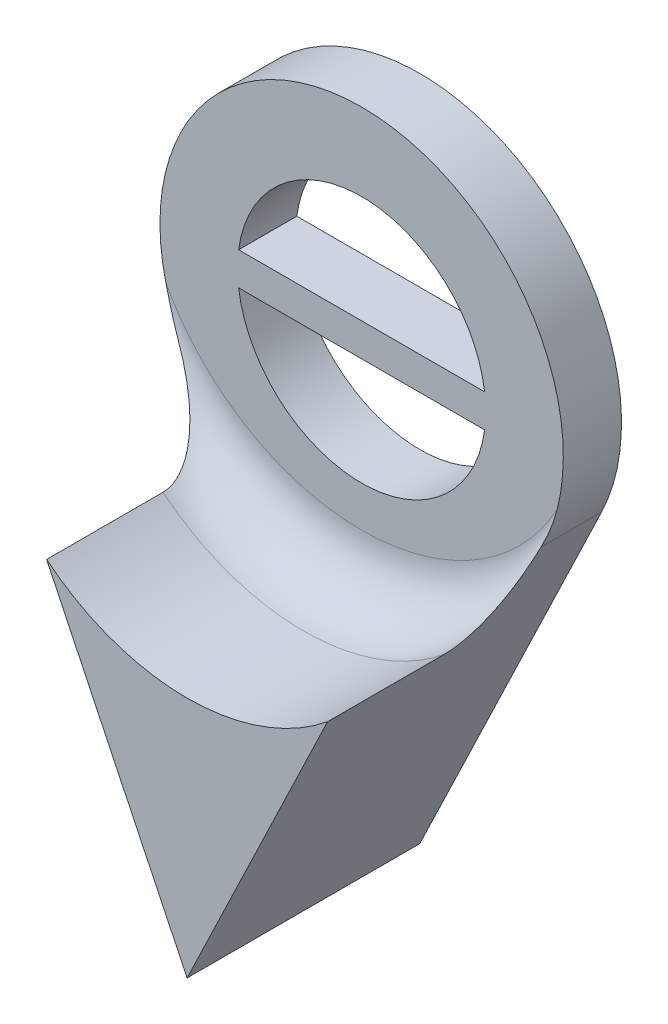
ISO-10303-21;
HEADER;
FILE_DESCRIPTION(('STEP AP214'),'2;1');
FILE_NAME('part.step','',(''),(''),'','','');
FILE_SCHEMA(('AUTOMOTIVE_DESIGN { 1 0 10303 214 1 1 1 1 }'));
ENDSEC;
DATA;
#1=APPLICATION_CONTEXT('core data for automotive mechanical design processes');
#2=APPLICATION_PROTOCOL_DEFINITION('international standard','automotive_design',2000,#1);
#3=PRODUCT_CONTEXT('',#1,'mechanical');
#4=PRODUCT('Part','Part','',(#3));
#5=PRODUCT_RELATED_PRODUCT_CATEGORY('part','',(#4));
#6=PRODUCT_DEFINITION_FORMATION('','',#4);
#7=PRODUCT_DEFINITION_CONTEXT('part definition',#1,'design');
#8=PRODUCT_DEFINITION('design','',#6,#7);
#9=PRODUCT_DEFINITION_SHAPE('','',#8);
#10=(LENGTH_UNIT() NAMED_UNIT(*) SI_UNIT(.MILLI.,.METRE.));
#11=(NAMED_UNIT(*) PLANE_ANGLE_UNIT() SI_UNIT($,.RADIAN.));
#12=(NAMED_UNIT(*) SI_UNIT($,.STERADIAN.) SOLID_ANGLE_UNIT());
#13=UNCERTAINTY_MEASURE_WITH_UNIT(LENGTH_MEASURE(1.E-05),#10,'distance_accuracy_value','');
#14=(GEOMETRIC_REPRESENTATION_CONTEXT(3) GLOBAL_UNCERTAINTY_ASSIGNED_CONTEXT((#13)) GLOBAL_UNIT_ASSIGNED_CONTEXT((#10,
#11,#12)) REPRESENTATION_CONTEXT('',''));
#15=CARTESIAN_POINT('',(0.,0.,0.));
#16=DIRECTION('',(0.,0.,1.));
#17=DIRECTION('',(1.,0.,0.));
#18=AXIS2_PLACEMENT_3D('',#15,#16,#17);
#19=CARTESIAN_POINT('',(5.04566046164159,-2.75750077168198,3.));
#20=CARTESIAN_POINT('',(4.95269364338297,-2.92761096854914,3.));
#21=CARTESIAN_POINT('',(4.85956311955654,-3.0781200618005,3.));
#22=CARTESIAN_POINT('',(4.6734657595974,-3.35393718213141,3.));
#23=CARTESIAN_POINT('',(4.58041709491514,-3.47914142045779,3.));
#24=CARTESIAN_POINT('',(4.30127106270729,-3.82755148794375,3.));
#25=CARTESIAN_POINT('',(4.11517372421482,-4.02402930681562,3.));
#26=CARTESIAN_POINT('',(3.83602769796778,-4.28528098974487,3.));
#27=CARTESIAN_POINT('',(3.74297902629931,-4.36659008857484,3.));
#28=CARTESIAN_POINT('',(3.55688167633855,-4.51946830207754,3.));
#29=CARTESIAN_POINT('',(3.46230001871877,-4.59231286042415,3.));
#30=CARTESIAN_POINT('',(3.17080826048503,-4.80269822972338,3.));
#31=CARTESIAN_POINT('',(2.96771788641945,-4.93077932470745,3.));
#32=CARTESIAN_POINT('',(2.33681773707668,-5.27555870719199,3.));
#33=CARTESIAN_POINT('',(1.88736166855441,-5.45253123116465,3.));
#34=CARTESIAN_POINT('',(0.958574183965192,-5.68975978654546,3.));
#35=CARTESIAN_POINT('',(0.479303843144452,-5.74999998074823,3.));
#36=CARTESIAN_POINT('',(-0.479303381234048,-5.75000001925176,3.));
#37=CARTESIAN_POINT('',(-0.95857372690638,-5.68975986354679,3.));
#38=CARTESIAN_POINT('',(-1.88736123053004,-5.45253138278317,3.));
#39=CARTESIAN_POINT('',(-2.33681731325028,-5.27555889492913,3.));
#40=CARTESIAN_POINT('',(-2.96771749032692,-4.9307795631067,3.));
#41=CARTESIAN_POINT('',(-3.17080787467614,-4.80269848443911,3.));
#42=CARTESIAN_POINT('',(-3.46229964979529,-4.59231313856785,3.));
#43=CARTESIAN_POINT('',(-3.55688131765014,-4.51946858415728,3.));
#44=CARTESIAN_POINT('',(-3.7429786676111,-4.36659039581701,3.));
#45=CARTESIAN_POINT('',(-3.83602733927949,-4.28528131052649,3.));
#46=CARTESIAN_POINT('',(-4.11517336552649,-4.02402967233726,3.));
#47=CARTESIAN_POINT('',(-4.30127070401902,-3.82755188814342,3.));
#48=CARTESIAN_POINT('',(-4.58041673622682,-3.47914189189143,3.));
#49=CARTESIAN_POINT('',(-4.67346540090908,-3.35393768057317,3.));
#50=CARTESIAN_POINT('',(-4.85956276086826,-3.07812062659105,3.));
#51=CARTESIAN_POINT('',(-4.95269328458468,-2.92761157249466,3.));
#52=CARTESIAN_POINT('',(-5.04566010295329,-2.75750142800785,3.));
#53=CARTESIAN_POINT('',(5.04566046164159,-2.75750077168198,1.5));
#54=CARTESIAN_POINT('',(4.95269361850157,-2.92761095554031,1.5));
#55=CARTESIAN_POINT('',(4.85956311359835,-3.07812005778044,1.5));
#56=CARTESIAN_POINT('',(4.67346576555559,-3.35393718615148,1.5));
#57=CARTESIAN_POINT('',(4.58041709153412,-3.47914141774891,1.5));
#58=CARTESIAN_POINT('',(4.30127106946934,-3.8275514933615,1.5));
#59=CARTESIAN_POINT('',(4.11517372142645,-4.02402930383626,1.5));
#60=CARTESIAN_POINT('',(3.83602769936197,-4.28528099123455,1.5));
#61=CARTESIAN_POINT('',(3.74297902534023,-4.36659008740737,1.5));
#62=CARTESIAN_POINT('',(3.55688167729762,-4.51946830324501,1.5));
#63=CARTESIAN_POINT('',(3.46230001871807,-4.59231286042319,1.5));
#64=CARTESIAN_POINT('',(3.17080826048642,-4.80269822972531,1.5));
#65=CARTESIAN_POINT('',(2.96771788642072,-4.93077932470978,1.5));
#66=CARTESIAN_POINT('',(2.33681773707413,-5.27555870718733,1.5));
#67=CARTESIAN_POINT('',(1.88736166855385,-5.45253123116244,1.5));
#68=CARTESIAN_POINT('',(0.958574183965758,-5.68975978654768,1.5));
#69=CARTESIAN_POINT('',(0.479303843144452,-5.74999998074818,1.5));
#70=CARTESIAN_POINT('',(-0.479303381234048,-5.75000001925181,1.5));
#71=CARTESIAN_POINT('',(-0.958573726906959,-5.68975986354906,1.5));
#72=CARTESIAN_POINT('',(-1.88736123052946,-5.45253138278091,1.5));
#73=CARTESIAN_POINT('',(-2.33681731324781,-5.27555889492461,1.5));
#74=CARTESIAN_POINT('',(-2.96771749032815,-4.93077956310896,1.5));
#75=CARTESIAN_POINT('',(-3.17080787467755,-4.80269848444107,1.5));
#76=CARTESIAN_POINT('',(-3.46229964979458,-4.59231313856688,1.5));
#77=CARTESIAN_POINT('',(-3.55688131860921,-4.51946858532474,1.5));
#78=CARTESIAN_POINT('',(-3.74297866665204,-4.36659039464955,1.5));
#79=CARTESIAN_POINT('',(-3.83602734067369,-4.28528131201618,1.5));
#80=CARTESIAN_POINT('',(-4.11517336273809,-4.02402966935787,1.5));
#81=CARTESIAN_POINT('',(-4.30127071078108,-3.82755189356118,1.5));
#82=CARTESIAN_POINT('',(-4.58041673284579,-3.47914188918255,1.5));
#83=CARTESIAN_POINT('',(-4.67346540686725,-3.35393768459323,1.5));
#84=CARTESIAN_POINT('',(-4.85956275491008,-3.07812062257099,1.5));
#85=CARTESIAN_POINT('',(-4.9526932597034,-2.92761155948589,1.5));
#86=CARTESIAN_POINT('',(-5.04566010295329,-2.75750142800785,1.5));
#87=CARTESIAN_POINT('',(5.04566046164159,-1.25750077168198,1.5));
#88=CARTESIAN_POINT('',(4.95269361850167,-1.42761095554045,1.5));
#89=CARTESIAN_POINT('',(4.8595631135986,-1.57812005778052,1.5));
#90=CARTESIAN_POINT('',(4.67346576555552,-1.85393718615151,1.5));
#91=CARTESIAN_POINT('',(4.58041709153407,-1.97914141774896,1.5));
#92=CARTESIAN_POINT('',(4.30127106946945,-2.3275514933614,1.5));
#93=CARTESIAN_POINT('',(4.11517372142644,-2.52402930383605,1.5));
#94=CARTESIAN_POINT('',(3.83602769936197,-2.78528099123465,1.5));
#95=CARTESIAN_POINT('',(3.74297902534044,-2.86659008740727,1.5));
#96=CARTESIAN_POINT('',(3.55688167729741,-3.01946830324511,1.5));
#97=CARTESIAN_POINT('',(3.46230001871799,-3.09231286042321,1.5));
#98=CARTESIAN_POINT('',(3.17080826048657,-3.30269822972526,1.5));
#99=CARTESIAN_POINT('',(2.96771788642082,-3.43077932470978,1.5));
#100=CARTESIAN_POINT('',(2.33681773707392,-3.77555870718733,1.5));
#101=CARTESIAN_POINT('',(1.887361668554,-3.95253123116244,1.5));
#102=CARTESIAN_POINT('',(0.958574183965601,-4.18975978654768,1.5));
#103=CARTESIAN_POINT('',(0.479303843144317,-4.24999998074839,1.5));
#104=CARTESIAN_POINT('',(-0.479303381233915,-4.2500000192516,1.5));
#105=CARTESIAN_POINT('',(-0.958573726906908,-4.18975986354906,1.5));
#106=CARTESIAN_POINT('',(-1.88736123052951,-3.95253138278091,1.5));
#107=CARTESIAN_POINT('',(-2.3368173132476,-3.77555889492471,1.5));
#108=CARTESIAN_POINT('',(-2.96771749032826,-3.43077956310891,1.5));
#109=CARTESIAN_POINT('',(-3.1708078746775,-3.30269848444106,1.5));
#110=CARTESIAN_POINT('',(-3.46229964979461,-3.09231313856688,1.5));
#111=CARTESIAN_POINT('',(-3.55688131860913,-3.01946858532477,1.5));
#112=CARTESIAN_POINT('',(-3.74297866665212,-2.86659039464952,1.5));
#113=CARTESIAN_POINT('',(-3.83602734067364,-2.78528131201623,1.5));
#114=CARTESIAN_POINT('',(-4.1151733627382,-2.52402966935777,1.5));
#115=CARTESIAN_POINT('',(-4.30127071078119,-2.32755189356102,1.5));
#116=CARTESIAN_POINT('',(-4.58041673284574,-1.97914188918263,1.5));
#117=CARTESIAN_POINT('',(-4.67346540686724,-1.85393768459326,1.5));
#118=CARTESIAN_POINT('',(-4.85956275491028,-1.57812062257108,1.5));
#119=CARTESIAN_POINT('',(-4.95269325970326,-1.42761155948588,1.5));
#120=CARTESIAN_POINT('',(-5.0456601029533,-1.25750142800785,1.5));
#121=(BOUNDED_SURFACE() B_SPLINE_SURFACE(2,3,((#19,#20,#21,#22,#23,#24,#25,#26,#27,#28,#29,#30,
#31,#32,#33,#34,#35,#36,#37,#38,#39,#40,#41,#42,#43,#44,#45,#46,#47,#48,#49,#50,#51,#52),(#53,
#54,#55,#56,#57,#58,#59,#60,#61,#62,#63,#64,#65,#66,#67,#68,#69,#70,#71,#72,#73,#74,#75,#76,#77,
#78,#79,#80,#81,#82,#83,#84,#85,#86),(#87,#88,#89,#90,#91,#92,#93,#94,#95,#96,#97,#98,#99,#100,
#101,#102,#103,#104,#105,#106,#107,#108,#109,#110,#111,#112,#113,#114,#115,#116,#117,#118,#119,
#120)),.UNSPECIFIED.,.F.,.F.,.F.) B_SPLINE_SURFACE_WITH_KNOTS((3,3),(4,2,2,2,2,2,2,2,2,2,2,2,2,
2,2,2,4),(0.,1.),(-0.233712071411254,-0.187855068789423,-0.141998066167591,-0.0502840609239272,
-0.00442705830209541,0.0414299443197364,0.1331439495634,0.316571960050727,0.499999970538054,
0.683427981025381,0.866855991512708,0.958569996756372,1.0044269993782,1.05028400200004,
1.1419980072437,1.18785500986553,1.23371201248736),
.UNSPECIFIED.) GEOMETRIC_REPRESENTATION_ITEM() RATIONAL_B_SPLINE_SURFACE(((1.,1.,1.,1.,1.,1.,1.,
1.,1.,1.,1.,1.,1.,1.,1.,1.,1.,1.,1.,1.,1.,1.,1.,1.,1.,1.,1.,1.,1.,1.,1.,1.,1.,1.),
(0.707106781186548,0.707106781186548,0.707106781186548,0.707106781186548,0.707106781186548,
0.707106781186548,0.707106781186548,0.707106781186548,0.707106781186548,0.707106781186548,
0.707106781186548,0.707106781186548,0.707106781186548,0.707106781186548,0.707106781186548,
0.707106781186548,0.707106781186548,0.707106781186548,0.707106781186548,0.707106781186548,
0.707106781186548,0.707106781186548,0.707106781186548,0.707106781186548,0.707106781186548,
0.707106781186548,0.707106781186548,0.707106781186548,0.707106781186548,0.707106781186548,
0.707106781186548,0.707106781186548,0.707106781186548,0.707106781186548),(1.,1.,1.,1.,1.,1.,1.,
1.,1.,1.,1.,1.,1.,1.,1.,1.,1.,1.,1.,1.,1.,1.,1.,1.,1.,1.,1.,1.,1.,1.,1.,1.,1.,1.))) REPRESENTATION_ITEM('') SURFACE());
#122=CARTESIAN_POINT('',(-5.04566010295329,-1.25750313139471,1.50000000000097));
#123=CARTESIAN_POINT('',(-5.03589804718135,-1.2966553889968,1.50000728779906));
#124=CARTESIAN_POINT('',(-5.02565654914561,-1.33568397287191,1.5004534417112));
#125=CARTESIAN_POINT('',(-5.00385434084783,-1.41492581465183,1.5021082485827));
#126=CARTESIAN_POINT('',(-4.99225865108418,-1.45512889296866,1.50334475065295));
#127=CARTESIAN_POINT('',(-4.96774719834827,-1.53646646852152,1.50649118698546));
#128=CARTESIAN_POINT('',(-4.95480164811462,-1.57759118262761,1.50842081775758));
#129=CARTESIAN_POINT('',(-4.92758401033078,-1.66052905771491,1.51286798520711));
#130=CARTESIAN_POINT('',(-4.91328657261862,-1.70233315632743,1.51539921568179));
#131=CARTESIAN_POINT('',(-4.88336212920052,-1.78640222827141,1.52095611746395));
#132=CARTESIAN_POINT('',(-4.86771383772343,-1.82865901692091,1.52399088110789));
#133=CARTESIAN_POINT('',(-4.83508420789384,-1.9134275134208,1.5304598541945));
#134=CARTESIAN_POINT('',(-4.81808516345185,-1.95593196332495,1.53389981767675));
#135=CARTESIAN_POINT('',(-4.7827578217875,-2.04102075202753,1.54108191177993));
#136=CARTESIAN_POINT('',(-4.76441495555448,-2.08359875737253,1.5448274279764));
#137=CARTESIAN_POINT('',(-4.7263917448875,-2.16866178877927,1.55252759898281));
#138=CARTESIAN_POINT('',(-4.7066996198918,-2.21114138990054,1.55648400375169));
#139=CARTESIAN_POINT('',(-4.68641535599321,-2.25333333333332,1.56047965716528));
#140=B_SPLINE_CURVE_WITH_KNOTS('',3,(#122,#123,#124,#125,#126,#127,#128,#129,#130,#131,#132,
#133,#134,#135,#136,#137,#138,#139),.UNSPECIFIED.,.F.,.F.,(4,2,2,2,2,2,2,2,4),(0.,
0.121041685760058,0.24660297809068,0.376058435887607,0.50880362359003,0.6442769024887,
0.781980693498671,0.921499796151165,1.06244876029481),.UNSPECIFIED.);
#141=CARTESIAN_POINT('',(-4.68641535599321,-2.25333333333332,1.56047965716528));
#142=VERTEX_POINT('',#141);
#143=CARTESIAN_POINT('',(-5.04566050265243,-1.25750152762261,1.5));
#144=VERTEX_POINT('',#143);
#145=EDGE_CURVE('E200',#142,#144,#140,.F.);
#146=CARTESIAN_POINT('',(-4.68641535599321,-2.25333333333332,1.56047965716528));
#147=CARTESIAN_POINT('',(-4.66449295454977,-2.29892347166709,1.56480019039416));
#148=CARTESIAN_POINT('',(-4.64257618562725,-2.34447895279041,1.56954584571331));
#149=CARTESIAN_POINT('',(-4.59867174929221,-2.43572683821192,1.58003673767141));
#150=CARTESIAN_POINT('',(-4.57668428366714,-2.48141877027661,1.58578690680943));
#151=CARTESIAN_POINT('',(-4.53263818992277,-2.5729760638547,1.59843529972941));
#152=CARTESIAN_POINT('',(-4.51058000561762,-2.61884066642117,1.6053406286185));
#153=CARTESIAN_POINT('',(-4.46639659159835,-2.71076037571897,1.62045701368525));
#154=CARTESIAN_POINT('',(-4.44427211926033,-2.75681429466209,1.62867756241345));
#155=CARTESIAN_POINT('',(-4.39995124621003,-2.84906958003152,1.64658972586945));
#156=CARTESIAN_POINT('',(-4.37775568636448,-2.89526917790251,1.65629258456532));
#157=CARTESIAN_POINT('',(-4.33233075546274,-2.98975349990614,1.67780704119376));
#158=CARTESIAN_POINT('',(-4.3091073698796,-3.03802230977691,1.68970182004259));
#159=CARTESIAN_POINT('',(-4.26363968520558,-3.13252971490334,1.71502201390609));
#160=CARTESIAN_POINT('',(-4.24138861393568,-3.17878222618476,1.72838294612946));
#161=CARTESIAN_POINT('',(-4.19786407597196,-3.26927964702132,1.75668177055568));
#162=CARTESIAN_POINT('',(-4.176582351267,-3.31354092503249,1.77155423943131));
#163=CARTESIAN_POINT('',(-4.13499951352239,-3.40005122662727,1.80291095441991));
#164=CARTESIAN_POINT('',(-4.11468872673817,-3.44231950529237,1.81932898348911));
#165=CARTESIAN_POINT('',(-4.07504531458108,-3.52481671187397,1.85379298986457));
#166=CARTESIAN_POINT('',(-4.05570193390426,-3.56506813844645,1.87177226671674));
#167=CARTESIAN_POINT('',(-4.02483999938675,-3.62926052624401,1.90254802426841));
#168=CARTESIAN_POINT('',(-4.01319542250742,-3.65347453308036,1.91465122336473));
#169=CARTESIAN_POINT('',(-3.990434920641,-3.70080532246204,1.93936759479047));
#170=CARTESIAN_POINT('',(-3.97931362849547,-3.72393320344787,1.9519544861419));
#171=CARTESIAN_POINT('',(-3.95759904684488,-3.76909314296906,1.97761609803398));
#172=CARTESIAN_POINT('',(-3.94699994361176,-3.79113722506981,1.99066470338488));
#173=CARTESIAN_POINT('',(-3.92633069837994,-3.83412921917327,2.01722740877678));
#174=CARTESIAN_POINT('',(-3.91625425104576,-3.85509012516588,2.03071552204206));
#175=CARTESIAN_POINT('',(-3.89663013178538,-3.89591059755442,2.05813371368842));
#176=CARTESIAN_POINT('',(-3.8870756968723,-3.91578427440082,2.0720378981419));
#177=CARTESIAN_POINT('',(-3.86849644882969,-3.95442902429125,2.10026176310398));
#178=CARTESIAN_POINT('',(-3.85946436854463,-3.97321524277708,2.11455587731725));
#179=CARTESIAN_POINT('',(-3.84193024621248,-4.00968360805872,2.14353196257612));
#180=CARTESIAN_POINT('',(-3.83342044011628,-4.02738195311233,2.15818880541589));
#181=CARTESIAN_POINT('',(-3.81693135208367,-4.06167372846133,2.18786118968012));
#182=CARTESIAN_POINT('',(-3.80894380556119,-4.07828439443105,2.20285217295216));
#183=CARTESIAN_POINT('',(-3.79349984201184,-4.11040032970134,2.233162184936));
#184=CARTESIAN_POINT('',(-3.78603465991424,-4.12592385320762,2.2484573732081));
#185=CARTESIAN_POINT('',(-3.77163551670715,-4.15586671413139,2.27934483975318));
#186=CARTESIAN_POINT('',(-3.76469231649199,-4.17030524979915,2.29491412302141));
#187=CARTESIAN_POINT('',(-3.75369892495352,-4.19316918431413,2.32076565131665));
#188=CARTESIAN_POINT('',(-3.74954763564579,-4.20180370756489,2.33082073005123));
#189=CARTESIAN_POINT('',(-3.74145017224715,-4.21864708081361,2.35104819842923));
#190=CARTESIAN_POINT('',(-3.73750171649689,-4.22686066036334,2.36121572759949));
#191=CARTESIAN_POINT('',(-3.72980999749011,-4.24286114223206,2.38165968086831));
#192=CARTESIAN_POINT('',(-3.72606440704695,-4.25065288281841,2.39193144064639));
#193=CARTESIAN_POINT('',(-3.71877845407617,-4.26580908004694,2.41257558994525));
#194=CARTESIAN_POINT('',(-3.71523572485384,-4.27317846592952,2.42294352166703));
#195=CARTESIAN_POINT('',(-3.70835553424497,-4.28748951214185,2.44377151210137));
#196=CARTESIAN_POINT('',(-3.70501567283301,-4.2944361768768,2.45422733632525));
#197=CARTESIAN_POINT('',(-3.69854124673145,-4.30790158376713,2.47522249841651));
#198=CARTESIAN_POINT('',(-3.69540425611372,-4.31442538636728,2.48575783954361));
#199=CARTESIAN_POINT('',(-3.68933560029787,-4.32704510734742,2.50690331997059));
#200=CARTESIAN_POINT('',(-3.68640149158271,-4.3331461211447,2.51750971401995));
#201=CARTESIAN_POINT('',(-3.68073859441139,-4.34492056816318,2.53878846709079));
#202=CARTESIAN_POINT('',(-3.67800735478788,-4.35059910811889,2.54945734542843));
#203=CARTESIAN_POINT('',(-3.67275027157048,-4.36152912709576,2.57085231056152));
#204=CARTESIAN_POINT('',(-3.67022197849832,-4.36678569915055,2.58157519012291));
#205=CARTESIAN_POINT('',(-3.66537052169314,-4.37687272977716,2.60306887667934));
#206=CARTESIAN_POINT('',(-3.66304492684677,-4.38170823753158,2.61383676592867));
#207=CARTESIAN_POINT('',(-3.65830247863821,-4.39157216989281,2.63685613460946));
#208=CARTESIAN_POINT('',(-3.65590766534126,-4.39655514420323,2.6491317540236));
#209=CARTESIAN_POINT('',(-3.65249765824898,-4.40365330734161,2.66766190654767));
#210=CARTESIAN_POINT('',(-3.65139553623788,-4.40594794000826,2.67383237750093));
#211=CARTESIAN_POINT('',(-3.64925441051484,-4.41040619823727,2.68619395733469));
#212=CARTESIAN_POINT('',(-3.6482151072303,-4.41257044539327,2.69238479014183));
#213=CARTESIAN_POINT('',(-3.6451989479973,-4.41885113802403,2.71094022185621));
#214=CARTESIAN_POINT('',(-3.64330700376825,-4.42279060246259,2.72337924594505));
#215=CARTESIAN_POINT('',(-3.6397765248465,-4.4301407211716,2.74832062486356));
#216=CARTESIAN_POINT('',(-3.63813581059331,-4.43355592444184,2.76082133305875));
#217=CARTESIAN_POINT('',(-3.63510794003274,-4.43985666286162,2.78587289701846));
#218=CARTESIAN_POINT('',(-3.63371876772634,-4.4427464101778,2.79842244732699));
#219=CARTESIAN_POINT('',(-3.6311942256895,-4.44799572899968,2.82355782440256));
#220=CARTESIAN_POINT('',(-3.63005702427494,-4.45035912745283,2.83614266709666));
#221=CARTESIAN_POINT('',(-3.62803654033568,-4.45455594077437,2.86133491113974));
#222=CARTESIAN_POINT('',(-3.62715163203136,-4.4563927494395,2.87394161583901));
#223=CARTESIAN_POINT('',(-3.62563575402383,-4.45953724399159,2.89916385587997));
#224=CARTESIAN_POINT('',(-3.62500338402692,-4.46084784784324,2.91177894273435));
#225=CARTESIAN_POINT('',(-3.62399259048336,-4.46294122697177,2.93700438471132));
#226=CARTESIAN_POINT('',(-3.62361300898192,-4.46372640914209,2.94961449323482));
#227=CARTESIAN_POINT('',(-3.62310741934928,-4.46477158217357,2.97481638879997));
#228=CARTESIAN_POINT('',(-3.62298051114201,-4.46503343724994,2.98740808063279));
#229=CARTESIAN_POINT('',(-3.62298070755635,-4.46503294865715,3.));
#230=B_SPLINE_CURVE_WITH_KNOTS('',3,(#146,#147,#148,#149,#150,#151,#152,#153,#154,#155,#156,
#157,#158,#159,#160,#161,#162,#163,#164,#165,#166,#167,#168,#169,#170,#171,#172,#173,#174,#175,
#176,#177,#178,#179,#180,#181,#182,#183,#184,#185,#186,#187,#188,#189,#190,#191,#192,#193,#194,
#195,#196,#197,#198,#199,#200,#201,#202,#203,#204,#205,#206,#207,#208,#209,#210,#211,#212,#213,
#214,#215,#216,#217,#218,#219,#220,#221,#222,#223,#224,#225,#226,#227,#228,#229),.UNSPECIFIED.,
.F.,.F.,(4,2,2,2,2,2,2,2,2,2,2,2,2,2,2,2,2,2,2,2,2,2,2,2,2,2,2,2,2,2,2,2,2,2,2,2,2,2,2,2,2,4),
(0.,0.152315881477456,0.305401860809767,0.459466605114212,0.614698120294017,0.771171667820866,
0.935748180626884,1.09482145460621,1.24872096793931,1.39773111728107,1.54209627964168,
1.63048837572529,1.71622235646432,1.79937383943186,1.88001229177092,1.95819978160052,
2.03400507228683,2.10749821299338,2.17875079173331,2.24783649939604,2.31483168750071,
2.35649169086737,2.39744708559013,2.43771759854327,2.47732356360732,2.51628596468273,
2.5546264755782,2.59236749626442,2.62953218494,2.66614448531889,2.70222914851935,
2.7426053157876,2.76262880688708,2.78254772642503,2.82208755455212,2.86126210959471,
2.90010727228302,2.93866004464921,2.97695845724006,3.01504145882234,3.05294879019484,
3.09072084424424),.UNSPECIFIED.);
#231=CARTESIAN_POINT('',(-3.62298145270317,-4.46503139892306,3.));
#232=VERTEX_POINT('',#231);
#233=EDGE_CURVE('E57',#142,#232,#230,.T.);
#234=CARTESIAN_POINT('',(-5.04566010295329,-2.75750142800785,3.));
#235=CARTESIAN_POINT('',(-4.95269328458468,-2.92761157249466,3.));
#236=CARTESIAN_POINT('',(-4.85956276086826,-3.07812062659105,3.));
#237=CARTESIAN_POINT('',(-4.67346540090908,-3.35393768057317,3.));
#238=CARTESIAN_POINT('',(-4.58041673622682,-3.47914189189143,3.));
#239=CARTESIAN_POINT('',(-4.30127070401902,-3.82755188814342,3.));
#240=CARTESIAN_POINT('',(-4.11517336552649,-4.02402967233726,3.));
#241=CARTESIAN_POINT('',(-3.83602733927949,-4.28528131052649,3.));
#242=CARTESIAN_POINT('',(-3.7429786676111,-4.36659039581701,3.));
#243=CARTESIAN_POINT('',(-3.55688131765014,-4.51946858415728,3.));
#244=CARTESIAN_POINT('',(-3.46229964979529,-4.59231313856785,3.));
#245=CARTESIAN_POINT('',(-3.17080787467614,-4.80269848443911,3.));
#246=CARTESIAN_POINT('',(-2.96771749032692,-4.9307795631067,3.));
#247=CARTESIAN_POINT('',(-2.33681731325028,-5.27555889492913,3.));
#248=CARTESIAN_POINT('',(-1.88736123053004,-5.45253138278317,3.));
#249=CARTESIAN_POINT('',(-0.95857372690638,-5.68975986354679,3.));
#250=CARTESIAN_POINT('',(-0.479303381234048,-5.75000001925176,3.));
#251=CARTESIAN_POINT('',(0.479303843144452,-5.74999998074823,3.));
#252=CARTESIAN_POINT('',(0.958574183965192,-5.68975978654546,3.));
#253=CARTESIAN_POINT('',(1.88736166855441,-5.45253123116465,3.));
#254=CARTESIAN_POINT('',(2.33681773707668,-5.27555870719199,3.));
#255=CARTESIAN_POINT('',(2.96771788641945,-4.93077932470745,3.));
#256=CARTESIAN_POINT('',(3.17080826048503,-4.80269822972338,3.));
#257=CARTESIAN_POINT('',(3.46230001871877,-4.59231286042415,3.));
#258=CARTESIAN_POINT('',(3.55688167633855,-4.51946830207754,3.));
#259=CARTESIAN_POINT('',(3.74297902629931,-4.36659008857484,3.));
#260=CARTESIAN_POINT('',(3.83602769796778,-4.28528098974487,3.));
#261=CARTESIAN_POINT('',(4.11517372421482,-4.02402930681562,3.));
#262=CARTESIAN_POINT('',(4.30127106270729,-3.82755148794375,3.));
#263=CARTESIAN_POINT('',(4.58041709491514,-3.47914142045779,3.));
#264=CARTESIAN_POINT('',(4.6734657595974,-3.35393718213141,3.));
#265=CARTESIAN_POINT('',(4.85956311955654,-3.0781200618005,3.));
#266=CARTESIAN_POINT('',(4.95269364338297,-2.92761096854914,3.));
#267=CARTESIAN_POINT('',(5.04566046164159,-2.75750077168198,3.));
#268=(BOUNDED_CURVE() B_SPLINE_CURVE(3,(#234,#235,#236,#237,#238,#239,#240,#241,#242,#243,#244,
#245,#246,#247,#248,#249,#250,#251,#252,#253,#254,#255,#256,#257,#258,#259,#260,#261,#262,#263,
#264,#265,#266,#267),.UNSPECIFIED.,.F.,.F.) B_SPLINE_CURVE_WITH_KNOTS((4,2,2,2,2,2,2,2,2,2,2,2,
2,2,2,2,4),(-0.233712071411254,-0.187855068789423,-0.141998066167591,-0.0502840609239271,
-0.00442705830209544,0.0414299443197365,0.1331439495634,0.316571960050727,0.499999970538054,
0.683427981025381,0.866855991512708,0.958569996756372,1.0044269993782,1.05028400200004,
1.1419980072437,1.18785500986553,1.23371201248736),
.UNSPECIFIED.) CURVE() GEOMETRIC_REPRESENTATION_ITEM() RATIONAL_B_SPLINE_CURVE((1.,1.,1.,1.,1.,
1.,1.,1.,1.,1.,1.,1.,1.,1.,1.,1.,1.,1.,1.,1.,1.,1.,1.,1.,1.,1.,1.,1.,1.,1.,1.,1.,1.,1.)) REPRESENTATION_ITEM(''));
#269=CARTESIAN_POINT('',(3.62298145270318,-4.46503139892305,3.));
#270=VERTEX_POINT('',#269);
#271=EDGE_CURVE('E147',#270,#232,#268,.F.);
#272=CARTESIAN_POINT('',(3.62298070752926,-4.46503294871351,3.));
#273=CARTESIAN_POINT('',(3.62298051111497,-4.46503343730626,2.98740808038637));
#274=CARTESIAN_POINT('',(3.62310741932195,-4.46477158222374,2.97481638830693));
#275=CARTESIAN_POINT('',(3.62361300895575,-4.46372640916708,2.94961449229961));
#276=CARTESIAN_POINT('',(3.62399259045762,-4.4629412269798,2.93700438358044));
#277=CARTESIAN_POINT('',(3.62500338400424,-4.46084784780802,2.91177894126519));
#278=CARTESIAN_POINT('',(3.62563575400274,-4.45953724393217,2.89916385426797));
#279=CARTESIAN_POINT('',(3.62715163201651,-4.45639274932577,2.87394161399625));
#280=CARTESIAN_POINT('',(3.62803654032445,-4.45455594063265,2.86133490920871));
#281=CARTESIAN_POINT('',(3.63005702427533,-4.45035912725241,2.83614266504557));
#282=CARTESIAN_POINT('',(3.63119422569688,-4.44799572877068,2.82355782231924));
#283=CARTESIAN_POINT('',(3.63371876775319,-4.44274640989243,2.79842244523662));
#284=CARTESIAN_POINT('',(3.63510794007109,-4.43985666255055,2.78587289495276));
#285=CARTESIAN_POINT('',(3.63813581066409,-4.43355592408168,2.76082133110156));
#286=CARTESIAN_POINT('',(3.63977652493735,-4.43014072079005,2.74832062298964));
#287=CARTESIAN_POINT('',(3.6433070039037,-4.42279060204856,2.72337924429377));
#288=CARTESIAN_POINT('',(3.64519894815644,-4.41885113760086,2.71094022034365));
#289=CARTESIAN_POINT('',(3.64821510745408,-4.41257044494539,2.69238478887331));
#290=CARTESIAN_POINT('',(3.64925441076335,-4.41040619778305,2.68619395616382));
#291=CARTESIAN_POINT('',(3.65139553647458,-4.40594793959565,2.67383237653027));
#292=CARTESIAN_POINT('',(3.65249765844858,-4.40365330697776,2.66766190567919));
#293=CARTESIAN_POINT('',(3.65590766544028,-4.39655514399294,2.64913175351381));
#294=CARTESIAN_POINT('',(3.6583024786926,-4.39157216977862,2.63685613436238));
#295=CARTESIAN_POINT('',(3.66304492685168,-4.38170823752232,2.61383676593953));
#296=CARTESIAN_POINT('',(3.6653705216982,-4.37687272976687,2.60306887669058));
#297=CARTESIAN_POINT('',(3.67022197850429,-4.36678569913775,2.58157519013482));
#298=CARTESIAN_POINT('',(3.67275027157722,-4.36152912708148,2.57085231057372));
#299=CARTESIAN_POINT('',(3.67800735479587,-4.35059910810201,2.54945734544089));
#300=CARTESIAN_POINT('',(3.68073859441985,-4.34492056814519,2.53878846710322));
#301=CARTESIAN_POINT('',(3.68640149159207,-4.33314612112467,2.51750971403208));
#302=CARTESIAN_POINT('',(3.68933560030766,-4.32704510732646,2.50690331998244));
#303=CARTESIAN_POINT('',(3.69540425612424,-4.3144253863447,2.48575783955465));
#304=CARTESIAN_POINT('',(3.69854124674228,-4.30790158374388,2.475222498427));
#305=CARTESIAN_POINT('',(3.70501567284437,-4.29443617685244,2.45422733633439));
#306=CARTESIAN_POINT('',(3.70835553425654,-4.28748951211705,2.44377151210971));
#307=CARTESIAN_POINT('',(3.71523572486574,-4.2731784659041,2.42294352167352));
#308=CARTESIAN_POINT('',(3.71877845408818,-4.26580908002134,2.41257558995068));
#309=CARTESIAN_POINT('',(3.72606440705907,-4.25065288279268,2.39193144064945));
#310=CARTESIAN_POINT('',(3.72980999750223,-4.24286114220641,2.38165968087006));
#311=CARTESIAN_POINT('',(3.73750171650898,-4.22686066033798,2.36121572759842));
#312=CARTESIAN_POINT('',(3.74145017225921,-4.21864708078849,2.35104819842668));
#313=CARTESIAN_POINT('',(3.74954763565739,-4.20180370754056,2.33082073004521));
#314=CARTESIAN_POINT('',(3.75369892496468,-4.19316918429035,2.32076565130865));
#315=CARTESIAN_POINT('',(3.76469231647735,-4.17030524983049,2.2949141230706));
#316=CARTESIAN_POINT('',(3.77163551666678,-4.15586671421959,2.27934483985931));
#317=CARTESIAN_POINT('',(3.78603465982874,-4.12592385340299,2.24845737341564));
#318=CARTESIAN_POINT('',(3.79349984190724,-4.11040032994665,2.23316218518853));
#319=CARTESIAN_POINT('',(3.80894380542412,-4.07828439476808,2.20285217328186));
#320=CARTESIAN_POINT('',(3.81693135193346,-4.06167372883975,2.18786119004253));
#321=CARTESIAN_POINT('',(3.83342043994579,-4.02738195356331,2.15818880583137));
#322=CARTESIAN_POINT('',(3.84193024603505,-4.00968360854047,2.14353196301251));
#323=CARTESIAN_POINT('',(3.85946436835911,-3.97321524330754,2.11455587778382));
#324=CARTESIAN_POINT('',(3.86849644864319,-3.95442902483923,2.10026176358042));
#325=CARTESIAN_POINT('',(3.88707569669043,-3.91578427496972,2.0720378986259));
#326=CARTESIAN_POINT('',(3.89663013160929,-3.89591059812632,2.05813371417071));
#327=CARTESIAN_POINT('',(3.9162542508885,-3.85509012571444,2.03071552250889));
#328=CARTESIAN_POINT('',(3.92633069823585,-3.83412921969477,2.01722740923099));
#329=CARTESIAN_POINT('',(3.94699994349395,-3.79113722548612,1.9906647038107));
#330=CARTESIAN_POINT('',(3.95759904674,-3.76909314330604,1.97761609844586));
#331=CARTESIAN_POINT('',(3.97931362842773,-3.72393320363687,1.95195448651026));
#332=CARTESIAN_POINT('',(3.99043492059782,-3.70080532258281,1.93936759512883));
#333=CARTESIAN_POINT('',(4.01319542251914,-3.65347453306456,1.91465122363955));
#334=CARTESIAN_POINT('',(4.02483999942895,-3.62926052615994,1.90254802450967));
#335=CARTESIAN_POINT('',(4.05570193419497,-3.56506813783576,1.87177226668936));
#336=CARTESIAN_POINT('',(4.0750453150928,-3.5248167108003,1.85379298961432));
#337=CARTESIAN_POINT('',(4.11468872757979,-3.44231950352035,1.81932898291855));
#338=CARTESIAN_POINT('',(4.13499951447086,-3.40005122462396,1.80291095373961));
#339=CARTESIAN_POINT('',(4.17658235231966,-3.31354092280339,1.77155423863984));
#340=CARTESIAN_POINT('',(4.19786407702043,-3.26927964480104,1.75668176975144));
#341=CARTESIAN_POINT('',(4.24138861486537,-3.17878222421997,1.7283829453862));
#342=CARTESIAN_POINT('',(4.26363968601951,-3.13252971318782,1.71502201322632));
#343=CARTESIAN_POINT('',(4.30910737035004,-3.03802230878955,1.68970181955682));
#344=CARTESIAN_POINT('',(4.33233075570448,-2.98975349939959,1.67780704082958));
#345=CARTESIAN_POINT('',(4.37775568619716,-2.89526917825406,1.65629258440989));
#346=CARTESIAN_POINT('',(4.39995124586265,-2.84906958075977,1.64658972580442));
#347=CARTESIAN_POINT('',(4.44427211861784,-2.75681429586368,1.6286775624806));
#348=CARTESIAN_POINT('',(4.46639659084183,-2.71076037701621,1.62045701380178));
#349=CARTESIAN_POINT('',(4.51058000475165,-2.61884066781991,1.60534062878191));
#350=CARTESIAN_POINT('',(4.5326381890612,-2.57297606525863,1.59843529989389));
#351=CARTESIAN_POINT('',(4.57668428290957,-2.4814187715638,1.58578690694622));
#352=CARTESIAN_POINT('',(4.59867174863428,-2.43572683937672,1.58003673778291));
#353=CARTESIAN_POINT('',(4.6425761852626,-2.34447895348955,1.56954584575066));
#354=CARTESIAN_POINT('',(4.66449295437899,-2.29892347202255,1.56480019038725));
#355=CARTESIAN_POINT('',(4.68641535599321,-2.25333333333332,1.5604796571207));
#356=B_SPLINE_CURVE_WITH_KNOTS('',3,(#272,#273,#274,#275,#276,#277,#278,#279,#280,#281,#282,
#283,#284,#285,#286,#287,#288,#289,#290,#291,#292,#293,#294,#295,#296,#297,#298,#299,#300,#301,
#302,#303,#304,#305,#306,#307,#308,#309,#310,#311,#312,#313,#314,#315,#316,#317,#318,#319,#320,
#321,#322,#323,#324,#325,#326,#327,#328,#329,#330,#331,#332,#333,#334,#335,#336,#337,#338,#339,
#340,#341,#342,#343,#344,#345,#346,#347,#348,#349,#350,#351,#352,#353,#354,#355),.UNSPECIFIED.,
.F.,.F.,(4,2,2,2,2,2,2,2,2,2,2,2,2,2,2,2,2,2,2,2,2,2,2,2,2,2,2,2,2,2,2,2,2,2,2,2,2,2,2,2,2,4),
(0.,0.0377720547888796,0.0756793867498862,0.113762388765182,0.152060801629801,0.19061357410782,
0.229458736744565,0.268633291572291,0.308173119323115,0.328092038606507,0.348115529354602,
0.388491695772227,0.424576358973569,0.461188659353936,0.498353348031489,0.536094368720056,
0.574434879618161,0.613397280696375,0.65300324576332,0.693273758719383,0.734229153445035,
0.775889156814573,0.842884344666056,0.911970052119696,0.98322263069767,1.05671577129281,
1.13252106192223,1.21070855175406,1.29134700418952,1.37449848738075,1.46023246835423,
1.54862456468376,1.69298972872144,1.84199987889298,1.99589939220887,2.15497266534217,
2.31954917650995,2.47602272275534,2.63125423751017,2.78531898180651,2.93840496160489,
3.09072084427071),.UNSPECIFIED.);
#357=CARTESIAN_POINT('',(4.6864153559932,-2.25333333333332,1.5604796571207));
#358=VERTEX_POINT('',#357);
#359=EDGE_CURVE('E12',#270,#358,#356,.T.);
#360=CARTESIAN_POINT('',(4.68641535599321,-2.25333333333332,1.56047965712069));
#361=CARTESIAN_POINT('',(4.70669964561643,-2.21114133646102,1.55648399864488));
#362=CARTESIAN_POINT('',(4.72639179345528,-2.16866168059853,1.5525275882062));
#363=CARTESIAN_POINT('',(4.76441504765278,-2.0835985309973,1.54482740502754));
#364=CARTESIAN_POINT('',(4.78275793443242,-2.04102046213207,1.54108188235974));
#365=CARTESIAN_POINT('',(4.81808531506538,-1.95593153838519,1.53389977560303));
#366=CARTESIAN_POINT('',(4.83508437780925,-1.91342701690145,1.53045980597054));
#367=CARTESIAN_POINT('',(4.86771404206474,-1.82865836987358,1.52399082208891));
#368=CARTESIAN_POINT('',(4.8833623495636,-1.78640150222937,1.52095605382603));
#369=CARTESIAN_POINT('',(4.91328682282299,-1.70233226581976,1.51539914556118));
#370=CARTESIAN_POINT('',(4.92758427427503,-1.66052808169966,1.51286791323097));
#371=CARTESIAN_POINT('',(4.9548019373084,-1.57759003026024,1.50842074609814));
#372=CARTESIAN_POINT('',(4.96774749899693,-1.53646522528138,1.50649111747403));
#373=CARTESIAN_POINT('',(4.99225897239063,-1.45512746399759,1.5033446906967));
#374=CARTESIAN_POINT('',(5.00385467132816,-1.41492429079998,1.50210819595934));
#375=CARTESIAN_POINT('',(5.02565689569153,-1.33568225685282,1.50045341025788));
#376=CARTESIAN_POINT('',(5.0358984006146,-1.29665357566782,1.50000727003749));
#377=CARTESIAN_POINT('',(5.04566046164159,-1.25750122073677,1.50000000000007));
#378=B_SPLINE_CURVE_WITH_KNOTS('',3,(#360,#361,#362,#363,#364,#365,#366,#367,#368,#369,#370,
#371,#372,#373,#374,#375,#376,#377),.UNSPECIFIED.,.F.,.F.,(4,2,2,2,2,2,2,2,4),(0.,
0.140949142645113,0.280468445482872,0.418172456917062,0.553645975018355,0.686391418558012,
0.815847146026429,0.941408718540139,1.0624506913059),.UNSPECIFIED.);
#379=CARTESIAN_POINT('',(5.04566067763524,-1.25750082551283,1.5));
#380=VERTEX_POINT('',#379);
#381=EDGE_CURVE('E198',#380,#358,#378,.F.);
#382=CARTESIAN_POINT('',(5.04566046164159,-1.25750077168198,1.5));
#383=CARTESIAN_POINT('',(4.95269361850167,-1.42761095554045,1.5));
#384=CARTESIAN_POINT('',(4.8595631135986,-1.57812005778052,1.5));
#385=CARTESIAN_POINT('',(4.67346576555552,-1.85393718615151,1.5));
#386=CARTESIAN_POINT('',(4.58041709153407,-1.97914141774896,1.5));
#387=CARTESIAN_POINT('',(4.30127106946945,-2.3275514933614,1.5));
#388=CARTESIAN_POINT('',(4.11517372142644,-2.52402930383605,1.5));
#389=CARTESIAN_POINT('',(3.83602769936197,-2.78528099123465,1.5));
#390=CARTESIAN_POINT('',(3.74297902534044,-2.86659008740727,1.5));
#391=CARTESIAN_POINT('',(3.55688167729741,-3.01946830324511,1.5));
#392=CARTESIAN_POINT('',(3.46230001871799,-3.09231286042321,1.5));
#393=CARTESIAN_POINT('',(3.17080826048657,-3.30269822972526,1.5));
#394=CARTESIAN_POINT('',(2.96771788642082,-3.43077932470978,1.5));
#395=CARTESIAN_POINT('',(2.33681773707392,-3.77555870718733,1.5));
#396=CARTESIAN_POINT('',(1.887361668554,-3.95253123116244,1.5));
#397=CARTESIAN_POINT('',(0.958574183965601,-4.18975978654768,1.5));
#398=CARTESIAN_POINT('',(0.479303843144317,-4.24999998074839,1.5));
#399=CARTESIAN_POINT('',(-0.479303381233915,-4.2500000192516,1.5));
#400=CARTESIAN_POINT('',(-0.958573726906908,-4.18975986354906,1.5));
#401=CARTESIAN_POINT('',(-1.88736123052951,-3.95253138278091,1.5));
#402=CARTESIAN_POINT('',(-2.3368173132476,-3.77555889492471,1.5));
#403=CARTESIAN_POINT('',(-2.96771749032826,-3.43077956310891,1.5));
#404=CARTESIAN_POINT('',(-3.1708078746775,-3.30269848444106,1.5));
#405=CARTESIAN_POINT('',(-3.46229964979461,-3.09231313856688,1.5));
#406=CARTESIAN_POINT('',(-3.55688131860913,-3.01946858532477,1.5));
#407=CARTESIAN_POINT('',(-3.74297866665212,-2.86659039464952,1.5));
#408=CARTESIAN_POINT('',(-3.83602734067364,-2.78528131201623,1.5));
#409=CARTESIAN_POINT('',(-4.1151733627382,-2.52402966935777,1.5));
#410=CARTESIAN_POINT('',(-4.30127071078119,-2.32755189356102,1.5));
#411=CARTESIAN_POINT('',(-4.58041673284574,-1.97914188918263,1.5));
#412=CARTESIAN_POINT('',(-4.67346540686724,-1.85393768459326,1.5));
#413=CARTESIAN_POINT('',(-4.85956275491028,-1.57812062257108,1.5));
#414=CARTESIAN_POINT('',(-4.95269325970326,-1.42761155948588,1.5));
#415=CARTESIAN_POINT('',(-5.0456601029533,-1.25750142800785,1.5));
#416=(BOUNDED_CURVE() B_SPLINE_CURVE(3,(#382,#383,#384,#385,#386,#387,#388,#389,#390,#391,#392,
#393,#394,#395,#396,#397,#398,#399,#400,#401,#402,#403,#404,#405,#406,#407,#408,#409,#410,#411,
#412,#413,#414,#415),.UNSPECIFIED.,.F.,.F.) B_SPLINE_CURVE_WITH_KNOTS((4,2,2,2,2,2,2,2,2,2,2,2,
2,2,2,2,4),(-0.233712071411254,-0.187855068789423,-0.141998066167591,-0.0502840609239272,
-0.00442705830209541,0.0414299443197364,0.1331439495634,0.316571960050727,0.499999970538054,
0.683427981025381,0.866855991512708,0.958569996756372,1.0044269993782,1.05028400200004,
1.1419980072437,1.18785500986553,1.23371201248736),
.UNSPECIFIED.) CURVE() GEOMETRIC_REPRESENTATION_ITEM() RATIONAL_B_SPLINE_CURVE((1.,1.,1.,1.,1.,
1.,1.,1.,1.,1.,1.,1.,1.,1.,1.,1.,1.,1.,1.,1.,1.,1.,1.,1.,1.,1.,1.,1.,1.,1.,1.,1.,1.,1.)) REPRESENTATION_ITEM(''));
#417=EDGE_CURVE('E190',#144,#380,#416,.F.);
#418=ORIENTED_EDGE('',*,*,#145,.F.);
#419=ORIENTED_EDGE('',*,*,#233,.T.);
#420=ORIENTED_EDGE('',*,*,#271,.F.);
#421=ORIENTED_EDGE('',*,*,#359,.T.);
#422=ORIENTED_EDGE('',*,*,#381,.F.);
#423=ORIENTED_EDGE('',*,*,#417,.F.);
#424=EDGE_LOOP('',(#418,#419,#420,#421,#422,#423));
#425=FACE_BOUND('',#424,.T.);
#426=ADVANCED_FACE('F45',(#425),#121,.T.);
#427=CARTESIAN_POINT('',(0.,0.,1.5));
#428=DIRECTION('',(0.,0.,1.));
#429=DIRECTION('',(1.,0.,0.));
#430=AXIS2_PLACEMENT_3D('',#427,#428,#429);
#431=PLANE('',#430);
#432=CARTESIAN_POINT('',(0.,0.,1.5));
#433=DIRECTION('',(0.,0.,1.));
#434=DIRECTION('',(1.,0.,0.));
#435=AXIS2_PLACEMENT_3D('',#432,#433,#434);
#436=CIRCLE('',#435,3.2);
#437=CARTESIAN_POINT('',(-3.17165177785961,-0.425,1.5));
#438=VERTEX_POINT('',#437);
#439=CARTESIAN_POINT('',(3.17165177785961,-0.425,1.5));
#440=VERTEX_POINT('',#439);
#441=EDGE_CURVE('E173',#438,#440,#436,.T.);
#442=ORIENTED_EDGE('',*,*,#441,.F.);
#443=DIRECTION('',(1.,0.,0.));
#444=VECTOR('',#443,1.);
#445=CARTESIAN_POINT('',(0.,-0.425,1.5));
#446=LINE('',#445,#444);
#447=EDGE_CURVE('E176',#438,#440,#446,.T.);
#448=ORIENTED_EDGE('',*,*,#447,.T.);
#449=EDGE_LOOP('',(#442,#448));
#450=FACE_BOUND('',#449,.T.);
#451=CARTESIAN_POINT('',(3.17165177785961,0.425,1.5));
#452=VERTEX_POINT('',#451);
#453=CARTESIAN_POINT('',(-3.17165177785961,0.425,1.5));
#454=VERTEX_POINT('',#453);
#455=EDGE_CURVE('E168',#452,#454,#436,.T.);
#456=ORIENTED_EDGE('',*,*,#455,.F.);
#457=DIRECTION('',(1.,0.,0.));
#458=VECTOR('',#457,1.);
#459=CARTESIAN_POINT('',(0.,0.425,1.5));
#460=LINE('',#459,#458);
#461=EDGE_CURVE('E171',#454,#452,#460,.T.);
#462=ORIENTED_EDGE('',*,*,#461,.F.);
#463=EDGE_LOOP('',(#456,#462));
#464=FACE_BOUND('',#463,.T.);
#465=CARTESIAN_POINT('',(0.,0.,1.5));
#466=DIRECTION('',(0.,0.,1.));
#467=DIRECTION('',(1.,0.,0.));
#468=AXIS2_PLACEMENT_3D('',#465,#466,#467);
#469=CIRCLE('',#468,5.2);
#470=EDGE_CURVE('E178',#380,#144,#469,.T.);
#471=ORIENTED_EDGE('',*,*,#470,.T.);
#472=ORIENTED_EDGE('',*,*,#417,.T.);
#473=EDGE_LOOP('',(#471,#472));
#474=FACE_BOUND('',#473,.T.);
#475=ADVANCED_FACE('F192',(#450,#464,#474),#431,.T.);
#476=CARTESIAN_POINT('',(0.,0.,1.5));
#477=DIRECTION('',(0.,0.,-1.));
#478=DIRECTION('',(-1.,0.,0.));
#479=AXIS2_PLACEMENT_3D('',#476,#477,#478);
#480=CYLINDRICAL_SURFACE('',#479,5.2);
#481=CARTESIAN_POINT('',(0.,0.,0.));
#482=DIRECTION('',(0.,0.,1.));
#483=DIRECTION('',(1.,0.,0.));
#484=AXIS2_PLACEMENT_3D('',#481,#482,#483);
#485=CIRCLE('',#484,5.2);
#486=CARTESIAN_POINT('',(4.68641535599321,-2.25333333333332,0.));
#487=VERTEX_POINT('',#486);
#488=CARTESIAN_POINT('',(-4.68641535599321,-2.25333333333332,0.));
#489=VERTEX_POINT('',#488);
#490=EDGE_CURVE('E416',#487,#489,#485,.T.);
#491=ORIENTED_EDGE('',*,*,#490,.T.);
#492=DIRECTION('',(0.,0.,-1.));
#493=VECTOR('',#492,1.);
#494=CARTESIAN_POINT('',(-4.68641535599321,-2.25333333333332,1.5));
#495=LINE('',#494,#493);
#496=EDGE_CURVE('E71',#142,#489,#495,.T.);
#497=ORIENTED_EDGE('',*,*,#496,.F.);
#498=ORIENTED_EDGE('',*,*,#145,.T.);
#499=ORIENTED_EDGE('',*,*,#470,.F.);
#500=ORIENTED_EDGE('',*,*,#381,.T.);
#501=DIRECTION('',(0.,0.,-1.));
#502=VECTOR('',#501,1.);
#503=CARTESIAN_POINT('',(4.68641535599321,-2.25333333333332,1.5));
#504=LINE('',#503,#502);
#505=EDGE_CURVE('E64',#358,#487,#504,.T.);
#506=ORIENTED_EDGE('',*,*,#505,.T.);
#507=EDGE_LOOP('',(#491,#497,#498,#499,#500,#506));
#508=FACE_BOUND('',#507,.T.);
#509=ADVANCED_FACE('F197',(#508),#480,.T.);
#510=CARTESIAN_POINT('',(-4.6864153559932,-2.25333333333333,1.5));
#511=DIRECTION('',(0.901233722306385,0.433333333333333,0.));
#512=DIRECTION('',(-0.433333333333333,0.901233722306385,0.));
#513=AXIS2_PLACEMENT_3D('',#510,#511,#512);
#514=PLANE('',#513);
#515=DIRECTION('',(0.433333333333333,-0.901233722306385,0.));
#516=VECTOR('',#515,1.);
#517=CARTESIAN_POINT('',(-4.6864153559932,-2.25333333333333,0.));
#518=LINE('',#517,#516);
#519=CARTESIAN_POINT('',(0.,-12.,0.));
#520=VERTEX_POINT('',#519);
#521=EDGE_CURVE('E418',#489,#520,#518,.T.);
#522=ORIENTED_EDGE('',*,*,#521,.T.);
#523=DIRECTION('',(0.,0.,-1.));
#524=VECTOR('',#523,1.);
#525=CARTESIAN_POINT('',(0.,-12.,1.5));
#526=LINE('',#525,#524);
#527=CARTESIAN_POINT('',(0.,-12.,6.));
#528=VERTEX_POINT('',#527);
#529=EDGE_CURVE('E132',#528,#520,#526,.T.);
#530=ORIENTED_EDGE('',*,*,#529,.F.);
#531=DIRECTION('',(0.433333333333333,-0.901233722306385,0.));
#532=VECTOR('',#531,1.);
#533=CARTESIAN_POINT('',(-3.62298145270317,-4.46503139892306,6.));
#534=LINE('',#533,#532);
#535=CARTESIAN_POINT('',(-3.62298145270317,-4.46503139892306,6.));
#536=VERTEX_POINT('',#535);
#537=EDGE_CURVE('E126',#536,#528,#534,.T.);
#538=ORIENTED_EDGE('',*,*,#537,.F.);
#539=DIRECTION('',(0.,0.,-1.));
#540=VECTOR('',#539,1.);
#541=CARTESIAN_POINT('',(-3.62298145270317,-4.46503139892306,6.));
#542=LINE('',#541,#540);
#543=EDGE_CURVE('E130',#536,#232,#542,.T.);
#544=ORIENTED_EDGE('',*,*,#543,.T.);
#545=ORIENTED_EDGE('',*,*,#233,.F.);
#546=ORIENTED_EDGE('',*,*,#496,.T.);
#547=EDGE_LOOP('',(#522,#530,#538,#544,#545,#546));
#548=FACE_BOUND('',#547,.T.);
#549=ADVANCED_FACE('F128',(#548),#514,.F.);
#550=CARTESIAN_POINT('',(0.,0.,1.5));
#551=DIRECTION('',(0.,0.,-1.));
#552=DIRECTION('',(-1.,0.,0.));
#553=AXIS2_PLACEMENT_3D('',#550,#551,#552);
#554=CYLINDRICAL_SURFACE('',#553,3.2);
#555=CARTESIAN_POINT('',(0.,0.,0.));
#556=DIRECTION('',(0.,0.,1.));
#557=DIRECTION('',(1.,0.,0.));
#558=AXIS2_PLACEMENT_3D('',#555,#556,#557);
#559=CIRCLE('',#558,3.2);
#560=CARTESIAN_POINT('',(-3.17165177785961,-0.425,0.));
#561=VERTEX_POINT('',#560);
#562=CARTESIAN_POINT('',(3.17165177785961,-0.425,0.));
#563=VERTEX_POINT('',#562);
#564=EDGE_CURVE('E155',#561,#563,#559,.T.);
#565=ORIENTED_EDGE('',*,*,#564,.F.);
#566=DIRECTION('',(0.,0.,-1.));
#567=VECTOR('',#566,1.);
#568=CARTESIAN_POINT('',(-3.17165177785961,-0.425,1.5));
#569=LINE('',#568,#567);
#570=EDGE_CURVE('E424',#438,#561,#569,.T.);
#571=ORIENTED_EDGE('',*,*,#570,.F.);
#572=ORIENTED_EDGE('',*,*,#441,.T.);
#573=DIRECTION('',(0.,0.,-1.));
#574=VECTOR('',#573,1.);
#575=CARTESIAN_POINT('',(3.17165177785961,-0.425,1.5));
#576=LINE('',#575,#574);
#577=EDGE_CURVE('E422',#440,#563,#576,.T.);
#578=ORIENTED_EDGE('',*,*,#577,.T.);
#579=EDGE_LOOP('',(#565,#571,#572,#578));
#580=FACE_BOUND('',#579,.T.);
#581=ADVANCED_FACE('F325',(#580),#554,.F.);
#582=CARTESIAN_POINT('',(3.17165177785961,0.425,0.));
#583=VERTEX_POINT('',#582);
#584=CARTESIAN_POINT('',(-3.17165177785961,0.425,0.));
#585=VERTEX_POINT('',#584);
#586=EDGE_CURVE('E149',#583,#585,#559,.T.);
#587=ORIENTED_EDGE('',*,*,#586,.F.);
#588=DIRECTION('',(0.,0.,-1.));
#589=VECTOR('',#588,1.);
#590=CARTESIAN_POINT('',(3.17165177785961,0.425,1.5));
#591=LINE('',#590,#589);
#592=EDGE_CURVE('E185',#452,#583,#591,.T.);
#593=ORIENTED_EDGE('',*,*,#592,.F.);
#594=ORIENTED_EDGE('',*,*,#455,.T.);
#595=DIRECTION('',(0.,0.,-1.));
#596=VECTOR('',#595,1.);
#597=CARTESIAN_POINT('',(-3.17165177785961,0.425,1.5));
#598=LINE('',#597,#596);
#599=EDGE_CURVE('E184',#454,#585,#598,.T.);
#600=ORIENTED_EDGE('',*,*,#599,.T.);
#601=EDGE_LOOP('',(#587,#593,#594,#600));
#602=FACE_BOUND('',#601,.T.);
#603=ADVANCED_FACE('F332',(#602),#554,.F.);
#604=CARTESIAN_POINT('',(0.,-0.425,1.5));
#605=DIRECTION('',(0.,1.,0.));
#606=DIRECTION('',(0.,0.,1.));
#607=AXIS2_PLACEMENT_3D('',#604,#605,#606);
#608=PLANE('',#607);
#609=DIRECTION('',(1.,0.,0.));
#610=VECTOR('',#609,1.);
#611=CARTESIAN_POINT('',(0.,-0.425,0.));
#612=LINE('',#611,#610);
#613=EDGE_CURVE('E412',#561,#563,#612,.T.);
#614=ORIENTED_EDGE('',*,*,#613,.T.);
#615=ORIENTED_EDGE('',*,*,#577,.F.);
#616=ORIENTED_EDGE('',*,*,#447,.F.);
#617=ORIENTED_EDGE('',*,*,#570,.T.);
#618=EDGE_LOOP('',(#614,#615,#616,#617));
#619=FACE_BOUND('',#618,.T.);
#620=ADVANCED_FACE('F223',(#619),#608,.F.);
#621=CARTESIAN_POINT('',(0.,0.425,1.5));
#622=DIRECTION('',(0.,1.,0.));
#623=DIRECTION('',(0.,0.,1.));
#624=AXIS2_PLACEMENT_3D('',#621,#622,#623);
#625=PLANE('',#624);
#626=DIRECTION('',(1.,0.,0.));
#627=VECTOR('',#626,1.);
#628=CARTESIAN_POINT('',(0.,0.425,0.));
#629=LINE('',#628,#627);
#630=EDGE_CURVE('E153',#585,#583,#629,.T.);
#631=ORIENTED_EDGE('',*,*,#630,.F.);
#632=ORIENTED_EDGE('',*,*,#599,.F.);
#633=ORIENTED_EDGE('',*,*,#461,.T.);
#634=ORIENTED_EDGE('',*,*,#592,.T.);
#635=EDGE_LOOP('',(#631,#632,#633,#634));
#636=FACE_BOUND('',#635,.T.);
#637=ADVANCED_FACE('F296',(#636),#625,.T.);
#638=CARTESIAN_POINT('',(4.6864153559932,-2.25333333333332,1.5));
#639=DIRECTION('',(-0.901233722306386,0.433333333333332,0.));
#640=DIRECTION('',(-0.433333333333332,-0.901233722306386,0.));
#641=AXIS2_PLACEMENT_3D('',#638,#639,#640);
#642=PLANE('',#641);
#643=DIRECTION('',(0.433333333333332,0.901233722306386,0.));
#644=VECTOR('',#643,1.);
#645=CARTESIAN_POINT('',(4.6864153559932,-2.25333333333332,0.));
#646=LINE('',#645,#644);
#647=EDGE_CURVE('E172',#520,#487,#646,.T.);
#648=ORIENTED_EDGE('',*,*,#647,.T.);
#649=ORIENTED_EDGE('',*,*,#505,.F.);
#650=ORIENTED_EDGE('',*,*,#359,.F.);
#651=DIRECTION('',(0.,0.,-1.));
#652=VECTOR('',#651,1.);
#653=CARTESIAN_POINT('',(3.62298145270318,-4.46503139892305,6.));
#654=LINE('',#653,#652);
#655=CARTESIAN_POINT('',(3.62298145270318,-4.46503139892305,6.));
#656=VERTEX_POINT('',#655);
#657=EDGE_CURVE('E150',#656,#270,#654,.T.);
#658=ORIENTED_EDGE('',*,*,#657,.F.);
#659=DIRECTION('',(0.433333333333332,0.901233722306386,0.));
#660=VECTOR('',#659,1.);
#661=CARTESIAN_POINT('',(0.,-12.,6.));
#662=LINE('',#661,#660);
#663=EDGE_CURVE('E135',#528,#656,#662,.T.);
#664=ORIENTED_EDGE('',*,*,#663,.F.);
#665=ORIENTED_EDGE('',*,*,#529,.T.);
#666=EDGE_LOOP('',(#648,#649,#650,#658,#664,#665));
#667=FACE_BOUND('',#666,.T.);
#668=ADVANCED_FACE('F286',(#667),#642,.F.);
#669=CARTESIAN_POINT('',(0.,0.,0.));
#670=DIRECTION('',(0.,0.,1.));
#671=DIRECTION('',(1.,0.,0.));
#672=AXIS2_PLACEMENT_3D('',#669,#670,#671);
#673=PLANE('',#672);
#674=ORIENTED_EDGE('',*,*,#586,.T.);
#675=ORIENTED_EDGE('',*,*,#630,.T.);
#676=EDGE_LOOP('',(#674,#675));
#677=FACE_BOUND('',#676,.T.);
#678=ORIENTED_EDGE('',*,*,#564,.T.);
#679=ORIENTED_EDGE('',*,*,#613,.F.);
#680=EDGE_LOOP('',(#678,#679));
#681=FACE_BOUND('',#680,.T.);
#682=ORIENTED_EDGE('',*,*,#490,.F.);
#683=ORIENTED_EDGE('',*,*,#647,.F.);
#684=ORIENTED_EDGE('',*,*,#521,.F.);
#685=EDGE_LOOP('',(#682,#683,#684));
#686=FACE_BOUND('',#685,.T.);
#687=ADVANCED_FACE('F295',(#677,#681,#686),#673,.F.);
#688=CARTESIAN_POINT('',(0.,0.,6.));
#689=DIRECTION('',(0.,0.,-1.));
#690=DIRECTION('',(-1.,0.,0.));
#691=AXIS2_PLACEMENT_3D('',#688,#689,#690);
#692=CYLINDRICAL_SURFACE('',#691,5.75);
#693=ORIENTED_EDGE('',*,*,#657,.T.);
#694=ORIENTED_EDGE('',*,*,#271,.T.);
#695=ORIENTED_EDGE('',*,*,#543,.F.);
#696=CARTESIAN_POINT('',(0.,0.,6.));
#697=DIRECTION('',(0.,0.,-1.));
#698=DIRECTION('',(-1.,0.,0.));
#699=AXIS2_PLACEMENT_3D('',#696,#697,#698);
#700=CIRCLE('',#699,5.75);
#701=EDGE_CURVE('E136',#656,#536,#700,.T.);
#702=ORIENTED_EDGE('',*,*,#701,.F.);
#703=EDGE_LOOP('',(#693,#694,#695,#702));
#704=FACE_BOUND('',#703,.T.);
#705=ADVANCED_FACE('F145',(#704),#692,.F.);
#706=CARTESIAN_POINT('',(0.,0.,6.));
#707=DIRECTION('',(0.,0.,-1.));
#708=DIRECTION('',(-1.,0.,0.));
#709=AXIS2_PLACEMENT_3D('',#706,#707,#708);
#710=PLANE('',#709);
#711=ORIENTED_EDGE('',*,*,#701,.T.);
#712=ORIENTED_EDGE('',*,*,#537,.T.);
#713=ORIENTED_EDGE('',*,*,#663,.T.);
#714=EDGE_LOOP('',(#711,#712,#713));
#715=FACE_BOUND('',#714,.T.);
#716=ADVANCED_FACE('F139',(#715),#710,.F.);
#717=CLOSED_SHELL('',(#426,#475,#509,#549,#581,#603,#620,#637,#668,#687,#705,#716));
#718=MANIFOLD_SOLID_BREP('B2',#717);
#719=ADVANCED_BREP_SHAPE_REPRESENTATION('',(#18,#718),#14);
#720=SHAPE_DEFINITION_REPRESENTATION(#9,#719);
ENDSEC;
END-ISO-10303-21;
